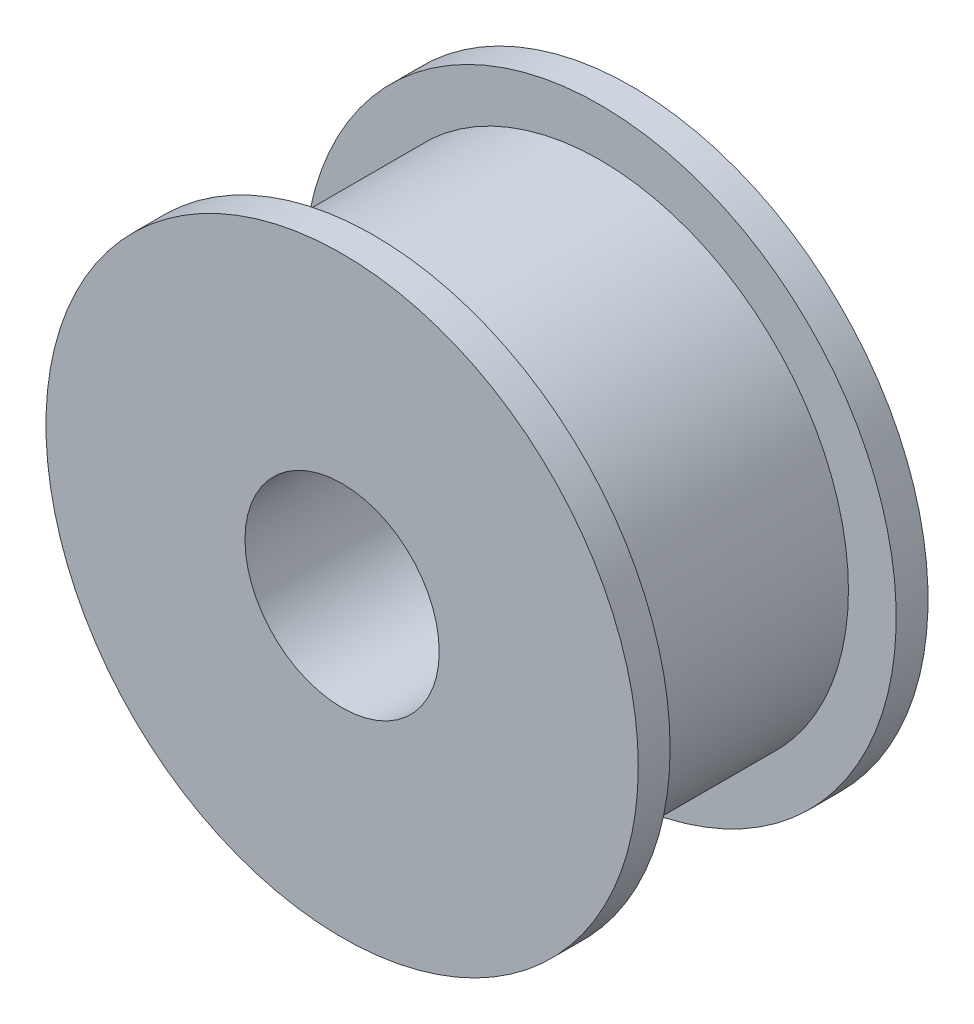
ISO-10303-21;
HEADER;
FILE_DESCRIPTION(('STEP AP214'),'2;1');
FILE_NAME('part.step','',(''),(''),'','','');
FILE_SCHEMA(('AUTOMOTIVE_DESIGN { 1 0 10303 214 1 1 1 1 }'));
ENDSEC;
DATA;
#1=APPLICATION_CONTEXT('core data for automotive mechanical design processes');
#2=APPLICATION_PROTOCOL_DEFINITION('international standard','automotive_design',2000,#1);
#3=PRODUCT_CONTEXT('',#1,'mechanical');
#4=PRODUCT('Part','Part','',(#3));
#5=PRODUCT_RELATED_PRODUCT_CATEGORY('part','',(#4));
#6=PRODUCT_DEFINITION_FORMATION('','',#4);
#7=PRODUCT_DEFINITION_CONTEXT('part definition',#1,'design');
#8=PRODUCT_DEFINITION('design','',#6,#7);
#9=PRODUCT_DEFINITION_SHAPE('','',#8);
#10=(LENGTH_UNIT() NAMED_UNIT(*) SI_UNIT(.MILLI.,.METRE.));
#11=(NAMED_UNIT(*) PLANE_ANGLE_UNIT() SI_UNIT($,.RADIAN.));
#12=(NAMED_UNIT(*) SI_UNIT($,.STERADIAN.) SOLID_ANGLE_UNIT());
#13=UNCERTAINTY_MEASURE_WITH_UNIT(LENGTH_MEASURE(1.E-05),#10,'distance_accuracy_value','');
#14=(GEOMETRIC_REPRESENTATION_CONTEXT(3) GLOBAL_UNCERTAINTY_ASSIGNED_CONTEXT((#13)) GLOBAL_UNIT_ASSIGNED_CONTEXT((#10,
#11,#12)) REPRESENTATION_CONTEXT('',''));
#15=CARTESIAN_POINT('',(0.,0.,0.));
#16=DIRECTION('',(0.,0.,1.));
#17=DIRECTION('',(1.,0.,0.));
#18=AXIS2_PLACEMENT_3D('',#15,#16,#17);
#19=CARTESIAN_POINT('',(0.,0.,9.1));
#20=DIRECTION('',(0.,0.,-1.));
#21=DIRECTION('',(-1.,0.,0.));
#22=AXIS2_PLACEMENT_3D('',#19,#20,#21);
#23=CYLINDRICAL_SURFACE('',#22,7.8);
#24=CARTESIAN_POINT('',(0.,0.,1.));
#25=DIRECTION('',(0.,0.,-1.));
#26=DIRECTION('',(-1.,0.,0.));
#27=AXIS2_PLACEMENT_3D('',#24,#25,#26);
#28=CIRCLE('',#27,7.8);
#29=CARTESIAN_POINT('',(-7.8,0.,1.));
#30=VERTEX_POINT('',#29);
#31=EDGE_CURVE('E43',#30,#30,#28,.T.);
#32=ORIENTED_EDGE('',*,*,#31,.F.);
#33=EDGE_LOOP('',(#32));
#34=FACE_BOUND('',#33,.T.);
#35=CARTESIAN_POINT('',(0.,0.,8.1));
#36=DIRECTION('',(0.,0.,1.));
#37=DIRECTION('',(1.,0.,0.));
#38=AXIS2_PLACEMENT_3D('',#35,#36,#37);
#39=CIRCLE('',#38,7.8);
#40=CARTESIAN_POINT('',(7.8,0.,8.1));
#41=VERTEX_POINT('',#40);
#42=EDGE_CURVE('E10',#41,#41,#39,.T.);
#43=ORIENTED_EDGE('',*,*,#42,.F.);
#44=EDGE_LOOP('',(#43));
#45=FACE_BOUND('',#44,.T.);
#46=ADVANCED_FACE('F37',(#34,#45),#23,.T.);
#47=CARTESIAN_POINT('',(0.,0.,9.1));
#48=DIRECTION('',(0.,0.,1.));
#49=DIRECTION('',(1.,0.,0.));
#50=AXIS2_PLACEMENT_3D('',#47,#48,#49);
#51=PLANE('',#50);
#52=CARTESIAN_POINT('',(0.,0.,9.1));
#53=DIRECTION('',(0.,0.,1.));
#54=DIRECTION('',(1.,0.,0.));
#55=AXIS2_PLACEMENT_3D('',#52,#53,#54);
#56=CIRCLE('',#55,3.05);
#57=CARTESIAN_POINT('',(3.05,0.,9.1));
#58=VERTEX_POINT('',#57);
#59=EDGE_CURVE('E47',#58,#58,#56,.T.);
#60=ORIENTED_EDGE('',*,*,#59,.F.);
#61=EDGE_LOOP('',(#60));
#62=FACE_BOUND('',#61,.T.);
#63=CARTESIAN_POINT('',(0.,0.,9.1));
#64=DIRECTION('',(0.,0.,1.));
#65=DIRECTION('',(1.,0.,0.));
#66=AXIS2_PLACEMENT_3D('',#63,#64,#65);
#67=CIRCLE('',#66,9.3);
#68=CARTESIAN_POINT('',(9.3,0.,9.1));
#69=VERTEX_POINT('',#68);
#70=EDGE_CURVE('E63',#69,#69,#67,.T.);
#71=ORIENTED_EDGE('',*,*,#70,.T.);
#72=EDGE_LOOP('',(#71));
#73=FACE_BOUND('',#72,.T.);
#74=ADVANCED_FACE('F81',(#62,#73),#51,.T.);
#75=CARTESIAN_POINT('',(0.,0.,0.));
#76=DIRECTION('',(0.,0.,1.));
#77=DIRECTION('',(1.,0.,0.));
#78=AXIS2_PLACEMENT_3D('',#75,#76,#77);
#79=PLANE('',#78);
#80=CARTESIAN_POINT('',(0.,0.,0.));
#81=DIRECTION('',(0.,0.,1.));
#82=DIRECTION('',(1.,0.,0.));
#83=AXIS2_PLACEMENT_3D('',#80,#81,#82);
#84=CIRCLE('',#83,3.05);
#85=CARTESIAN_POINT('',(3.05,0.,0.));
#86=VERTEX_POINT('',#85);
#87=EDGE_CURVE('E51',#86,#86,#84,.T.);
#88=ORIENTED_EDGE('',*,*,#87,.T.);
#89=EDGE_LOOP('',(#88));
#90=FACE_BOUND('',#89,.T.);
#91=CARTESIAN_POINT('',(0.,0.,0.));
#92=DIRECTION('',(0.,0.,-1.));
#93=DIRECTION('',(-1.,0.,0.));
#94=AXIS2_PLACEMENT_3D('',#91,#92,#93);
#95=CIRCLE('',#94,9.3);
#96=CARTESIAN_POINT('',(-9.3,0.,0.));
#97=VERTEX_POINT('',#96);
#98=EDGE_CURVE('E57',#97,#97,#95,.T.);
#99=ORIENTED_EDGE('',*,*,#98,.T.);
#100=EDGE_LOOP('',(#99));
#101=FACE_BOUND('',#100,.T.);
#102=ADVANCED_FACE('F87',(#90,#101),#79,.F.);
#103=CARTESIAN_POINT('',(0.,0.,9.1));
#104=DIRECTION('',(0.,0.,-1.));
#105=DIRECTION('',(-1.,0.,0.));
#106=AXIS2_PLACEMENT_3D('',#103,#104,#105);
#107=CYLINDRICAL_SURFACE('',#106,3.05);
#108=ORIENTED_EDGE('',*,*,#59,.T.);
#109=EDGE_LOOP('',(#108));
#110=FACE_BOUND('',#109,.T.);
#111=ORIENTED_EDGE('',*,*,#87,.F.);
#112=EDGE_LOOP('',(#111));
#113=FACE_BOUND('',#112,.T.);
#114=ADVANCED_FACE('F94',(#110,#113),#107,.F.);
#115=CARTESIAN_POINT('',(0.,0.,1.));
#116=DIRECTION('',(0.,0.,-1.));
#117=DIRECTION('',(-1.,0.,0.));
#118=AXIS2_PLACEMENT_3D('',#115,#116,#117);
#119=CYLINDRICAL_SURFACE('',#118,9.3);
#120=CARTESIAN_POINT('',(0.,0.,1.));
#121=DIRECTION('',(0.,0.,-1.));
#122=DIRECTION('',(-1.,0.,0.));
#123=AXIS2_PLACEMENT_3D('',#120,#121,#122);
#124=CIRCLE('',#123,9.3);
#125=CARTESIAN_POINT('',(-9.3,0.,1.));
#126=VERTEX_POINT('',#125);
#127=EDGE_CURVE('E55',#126,#126,#124,.T.);
#128=ORIENTED_EDGE('',*,*,#127,.T.);
#129=EDGE_LOOP('',(#128));
#130=FACE_BOUND('',#129,.T.);
#131=ORIENTED_EDGE('',*,*,#98,.F.);
#132=EDGE_LOOP('',(#131));
#133=FACE_BOUND('',#132,.T.);
#134=ADVANCED_FACE('F101',(#130,#133),#119,.T.);
#135=CARTESIAN_POINT('',(0.,0.,1.));
#136=DIRECTION('',(0.,0.,-1.));
#137=DIRECTION('',(-1.,0.,0.));
#138=AXIS2_PLACEMENT_3D('',#135,#136,#137);
#139=PLANE('',#138);
#140=ORIENTED_EDGE('',*,*,#31,.T.);
#141=EDGE_LOOP('',(#140));
#142=FACE_BOUND('',#141,.T.);
#143=ORIENTED_EDGE('',*,*,#127,.F.);
#144=EDGE_LOOP('',(#143));
#145=FACE_BOUND('',#144,.T.);
#146=ADVANCED_FACE('F78',(#142,#145),#139,.F.);
#147=CARTESIAN_POINT('',(0.,0.,8.1));
#148=DIRECTION('',(0.,0.,1.));
#149=DIRECTION('',(1.,0.,0.));
#150=AXIS2_PLACEMENT_3D('',#147,#148,#149);
#151=CYLINDRICAL_SURFACE('',#150,9.3);
#152=CARTESIAN_POINT('',(0.,0.,8.1));
#153=DIRECTION('',(0.,0.,1.));
#154=DIRECTION('',(1.,0.,0.));
#155=AXIS2_PLACEMENT_3D('',#152,#153,#154);
#156=CIRCLE('',#155,9.3);
#157=CARTESIAN_POINT('',(9.3,0.,8.1));
#158=VERTEX_POINT('',#157);
#159=EDGE_CURVE('E60',#158,#158,#156,.T.);
#160=ORIENTED_EDGE('',*,*,#159,.T.);
#161=EDGE_LOOP('',(#160));
#162=FACE_BOUND('',#161,.T.);
#163=ORIENTED_EDGE('',*,*,#70,.F.);
#164=EDGE_LOOP('',(#163));
#165=FACE_BOUND('',#164,.T.);
#166=ADVANCED_FACE('F69',(#162,#165),#151,.T.);
#167=CARTESIAN_POINT('',(0.,0.,8.1));
#168=DIRECTION('',(0.,0.,1.));
#169=DIRECTION('',(1.,0.,0.));
#170=AXIS2_PLACEMENT_3D('',#167,#168,#169);
#171=PLANE('',#170);
#172=ORIENTED_EDGE('',*,*,#42,.T.);
#173=EDGE_LOOP('',(#172));
#174=FACE_BOUND('',#173,.T.);
#175=ORIENTED_EDGE('',*,*,#159,.F.);
#176=EDGE_LOOP('',(#175));
#177=FACE_BOUND('',#176,.T.);
#178=ADVANCED_FACE('F72',(#174,#177),#171,.F.);
#179=CLOSED_SHELL('',(#46,#74,#102,#114,#134,#146,#166,#178));
#180=MANIFOLD_SOLID_BREP('B2',#179);
#181=ADVANCED_BREP_SHAPE_REPRESENTATION('',(#18,#180),#14);
#182=SHAPE_DEFINITION_REPRESENTATION(#9,#181);
ENDSEC;
END-ISO-10303-21;
